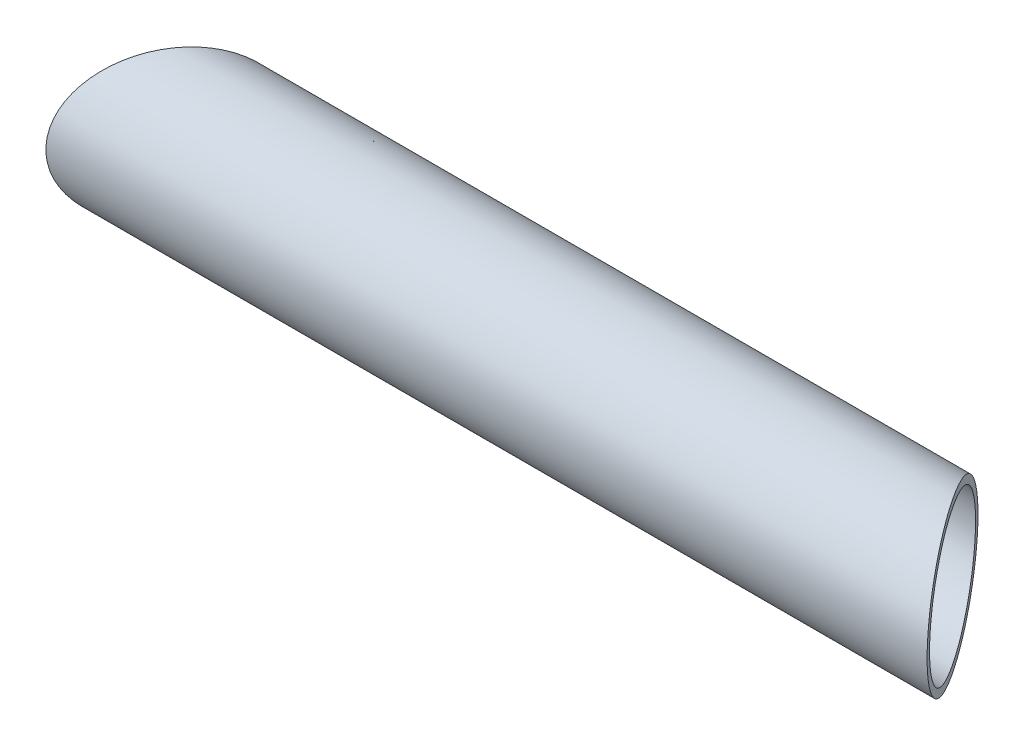
ISO-10303-21;
HEADER;
FILE_DESCRIPTION(('STEP AP214'),'2;1');
FILE_NAME('part.step','',(''),(''),'','','');
FILE_SCHEMA(('AUTOMOTIVE_DESIGN { 1 0 10303 214 1 1 1 1 }'));
ENDSEC;
DATA;
#1=APPLICATION_CONTEXT('core data for automotive mechanical design processes');
#2=APPLICATION_PROTOCOL_DEFINITION('international standard','automotive_design',2000,#1);
#3=PRODUCT_CONTEXT('',#1,'mechanical');
#4=PRODUCT('Part','Part','',(#3));
#5=PRODUCT_RELATED_PRODUCT_CATEGORY('part','',(#4));
#6=PRODUCT_DEFINITION_FORMATION('','',#4);
#7=PRODUCT_DEFINITION_CONTEXT('part definition',#1,'design');
#8=PRODUCT_DEFINITION('design','',#6,#7);
#9=PRODUCT_DEFINITION_SHAPE('','',#8);
#10=(LENGTH_UNIT() NAMED_UNIT(*) SI_UNIT(.MILLI.,.METRE.));
#11=(NAMED_UNIT(*) PLANE_ANGLE_UNIT() SI_UNIT($,.RADIAN.));
#12=(NAMED_UNIT(*) SI_UNIT($,.STERADIAN.) SOLID_ANGLE_UNIT());
#13=UNCERTAINTY_MEASURE_WITH_UNIT(LENGTH_MEASURE(1.E-05),#10,'distance_accuracy_value','');
#14=(GEOMETRIC_REPRESENTATION_CONTEXT(3) GLOBAL_UNCERTAINTY_ASSIGNED_CONTEXT((#13)) GLOBAL_UNIT_ASSIGNED_CONTEXT((#10,
#11,#12)) REPRESENTATION_CONTEXT('',''));
#15=CARTESIAN_POINT('',(0.,0.,0.));
#16=DIRECTION('',(0.,0.,1.));
#17=DIRECTION('',(1.,0.,0.));
#18=AXIS2_PLACEMENT_3D('',#15,#16,#17);
#19=CARTESIAN_POINT('',(-65.,0.,0.));
#20=DIRECTION('',(1.,0.,0.));
#21=DIRECTION('',(0.,0.,-1.));
#22=AXIS2_PLACEMENT_3D('',#19,#20,#21);
#23=CYLINDRICAL_SURFACE('',#22,11.3);
#24=CARTESIAN_POINT('',(-65.,0.,0.));
#25=DIRECTION('',(-0.834008585191079,0.,-0.551751465632466));
#26=DIRECTION('',(0.551751465632466,0.,-0.834008585191079));
#27=AXIS2_PLACEMENT_3D('',#24,#25,#26);
#28=ELLIPSE('',#27,13.5490211979186,11.3);
#29=CARTESIAN_POINT('',(-57.5243076961631,0.,-11.3));
#30=VERTEX_POINT('',#29);
#31=EDGE_CURVE('E53',#30,#30,#28,.T.);
#32=ORIENTED_EDGE('',*,*,#31,.T.);
#33=EDGE_LOOP('',(#32));
#34=FACE_BOUND('',#33,.T.);
#35=CARTESIAN_POINT('',(65.,0.,0.));
#36=DIRECTION('',(0.834008585191079,0.,-0.551751465632466));
#37=DIRECTION('',(0.551751465632466,0.,0.834008585191079));
#38=AXIS2_PLACEMENT_3D('',#35,#36,#37);
#39=ELLIPSE('',#38,13.5490211979186,11.3);
#40=CARTESIAN_POINT('',(72.475692303837,0.,11.3));
#41=VERTEX_POINT('',#40);
#42=EDGE_CURVE('E43',#41,#41,#39,.T.);
#43=ORIENTED_EDGE('',*,*,#42,.T.);
#44=EDGE_LOOP('',(#43));
#45=FACE_BOUND('',#44,.T.);
#46=ADVANCED_FACE('F39',(#34,#45),#23,.F.);
#47=CARTESIAN_POINT('',(-65.,0.,0.));
#48=DIRECTION('',(1.,0.,0.));
#49=DIRECTION('',(0.,0.,-1.));
#50=AXIS2_PLACEMENT_3D('',#47,#48,#49);
#51=CYLINDRICAL_SURFACE('',#50,12.5);
#52=CARTESIAN_POINT('',(-65.,0.,0.));
#53=DIRECTION('',(-0.834008585191079,0.,-0.551751465632466));
#54=DIRECTION('',(0.551751465632466,0.,-0.834008585191079));
#55=AXIS2_PLACEMENT_3D('',#52,#53,#54);
#56=ELLIPSE('',#55,14.987855307432,12.5);
#57=CARTESIAN_POINT('',(-56.7304288674371,0.,-12.5));
#58=VERTEX_POINT('',#57);
#59=EDGE_CURVE('E47',#58,#58,#56,.T.);
#60=ORIENTED_EDGE('',*,*,#59,.F.);
#61=EDGE_LOOP('',(#60));
#62=FACE_BOUND('',#61,.T.);
#63=CARTESIAN_POINT('',(65.,0.,0.));
#64=DIRECTION('',(0.834008585191079,0.,-0.551751465632466));
#65=DIRECTION('',(0.551751465632466,0.,0.834008585191079));
#66=AXIS2_PLACEMENT_3D('',#63,#64,#65);
#67=ELLIPSE('',#66,14.987855307432,12.5);
#68=CARTESIAN_POINT('',(73.269571132563,0.,12.5));
#69=VERTEX_POINT('',#68);
#70=EDGE_CURVE('E10',#69,#69,#67,.T.);
#71=ORIENTED_EDGE('',*,*,#70,.F.);
#72=EDGE_LOOP('',(#71));
#73=FACE_BOUND('',#72,.T.);
#74=ADVANCED_FACE('F67',(#62,#73),#51,.T.);
#75=CARTESIAN_POINT('',(-65.,0.,0.));
#76=DIRECTION('',(-0.834008585191079,0.,-0.551751465632466));
#77=DIRECTION('',(-0.551751465632466,0.,0.834008585191079));
#78=AXIS2_PLACEMENT_3D('',#75,#76,#77);
#79=PLANE('',#78);
#80=ORIENTED_EDGE('',*,*,#31,.F.);
#81=EDGE_LOOP('',(#80));
#82=FACE_BOUND('',#81,.T.);
#83=ORIENTED_EDGE('',*,*,#59,.T.);
#84=EDGE_LOOP('',(#83));
#85=FACE_BOUND('',#84,.T.);
#86=ADVANCED_FACE('F62',(#82,#85),#79,.T.);
#87=CARTESIAN_POINT('',(65.,0.,0.));
#88=DIRECTION('',(0.834008585191079,0.,-0.551751465632466));
#89=DIRECTION('',(-0.551751465632466,0.,-0.834008585191079));
#90=AXIS2_PLACEMENT_3D('',#87,#88,#89);
#91=PLANE('',#90);
#92=ORIENTED_EDGE('',*,*,#42,.F.);
#93=EDGE_LOOP('',(#92));
#94=FACE_BOUND('',#93,.T.);
#95=ORIENTED_EDGE('',*,*,#70,.T.);
#96=EDGE_LOOP('',(#95));
#97=FACE_BOUND('',#96,.T.);
#98=ADVANCED_FACE('F41',(#94,#97),#91,.T.);
#99=CLOSED_SHELL('',(#46,#74,#86,#98));
#100=MANIFOLD_SOLID_BREP('B2',#99);
#101=ADVANCED_BREP_SHAPE_REPRESENTATION('',(#18,#100),#14);
#102=SHAPE_DEFINITION_REPRESENTATION(#9,#101);
ENDSEC;
END-ISO-10303-21;
